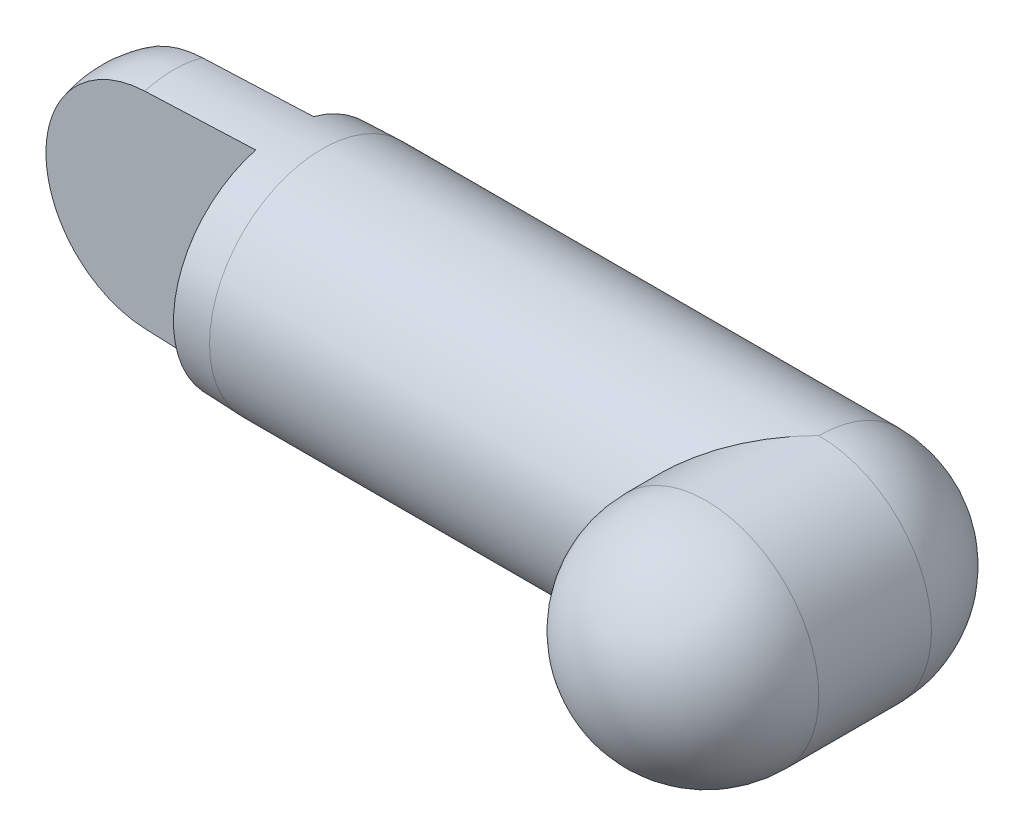
ISO-10303-21;
HEADER;
FILE_DESCRIPTION(('STEP AP214'),'2;1');
FILE_NAME('part.step','',(''),(''),'','','');
FILE_SCHEMA(('AUTOMOTIVE_DESIGN { 1 0 10303 214 1 1 1 1 }'));
ENDSEC;
DATA;
#1=APPLICATION_CONTEXT('core data for automotive mechanical design processes');
#2=APPLICATION_PROTOCOL_DEFINITION('international standard','automotive_design',2000,#1);
#3=PRODUCT_CONTEXT('',#1,'mechanical');
#4=PRODUCT('Part','Part','',(#3));
#5=PRODUCT_RELATED_PRODUCT_CATEGORY('part','',(#4));
#6=PRODUCT_DEFINITION_FORMATION('','',#4);
#7=PRODUCT_DEFINITION_CONTEXT('part definition',#1,'design');
#8=PRODUCT_DEFINITION('design','',#6,#7);
#9=PRODUCT_DEFINITION_SHAPE('','',#8);
#10=(LENGTH_UNIT() NAMED_UNIT(*) SI_UNIT(.MILLI.,.METRE.));
#11=(NAMED_UNIT(*) PLANE_ANGLE_UNIT() SI_UNIT($,.RADIAN.));
#12=(NAMED_UNIT(*) SI_UNIT($,.STERADIAN.) SOLID_ANGLE_UNIT());
#13=UNCERTAINTY_MEASURE_WITH_UNIT(LENGTH_MEASURE(1.E-05),#10,'distance_accuracy_value','');
#14=(GEOMETRIC_REPRESENTATION_CONTEXT(3) GLOBAL_UNCERTAINTY_ASSIGNED_CONTEXT((#13)) GLOBAL_UNIT_ASSIGNED_CONTEXT((#10,
#11,#12)) REPRESENTATION_CONTEXT('',''));
#15=CARTESIAN_POINT('',(0.,0.,0.));
#16=DIRECTION('',(0.,0.,1.));
#17=DIRECTION('',(1.,0.,0.));
#18=AXIS2_PLACEMENT_3D('',#15,#16,#17);
#19=CARTESIAN_POINT('',(-1000.,0.,0.));
#20=DIRECTION('',(-1.,0.,0.));
#21=DIRECTION('',(0.,0.,1.));
#22=AXIS2_PLACEMENT_3D('',#19,#20,#21);
#23=CYLINDRICAL_SURFACE('',#22,49.53);
#24=CARTESIAN_POINT('',(8.00000000000001,0.,0.));
#25=DIRECTION('',(-1.,0.,0.));
#26=DIRECTION('',(0.,0.,1.));
#27=AXIS2_PLACEMENT_3D('',#24,#25,#26);
#28=CIRCLE('',#27,49.53);
#29=CARTESIAN_POINT('',(8.00000000000001,0.,49.53));
#30=VERTEX_POINT('',#29);
#31=EDGE_CURVE('E143',#30,#30,#28,.T.);
#32=ORIENTED_EDGE('',*,*,#31,.F.);
#33=EDGE_LOOP('',(#32));
#34=FACE_BOUND('',#33,.T.);
#35=CARTESIAN_POINT('',(226.44,0.,0.));
#36=DIRECTION('',(-0.707106781186547,0.,-0.707106781186547));
#37=DIRECTION('',(-0.707106781186547,0.,0.707106781186547));
#38=AXIS2_PLACEMENT_3D('',#35,#36,#37);
#39=ELLIPSE('',#38,70.0459977443394,49.53);
#40=CARTESIAN_POINT('',(226.44,49.53,0.));
#41=VERTEX_POINT('',#40);
#42=CARTESIAN_POINT('',(176.91,0.,49.53));
#43=VERTEX_POINT('',#42);
#44=EDGE_CURVE('E86',#41,#43,#39,.F.);
#45=ORIENTED_EDGE('',*,*,#44,.F.);
#46=CARTESIAN_POINT('',(226.44,0.,0.));
#47=DIRECTION('',(-1.,0.,0.));
#48=DIRECTION('',(0.,0.,1.));
#49=AXIS2_PLACEMENT_3D('',#46,#47,#48);
#50=CIRCLE('',#49,49.53);
#51=CARTESIAN_POINT('',(226.44,-49.53,0.));
#52=VERTEX_POINT('',#51);
#53=EDGE_CURVE('E137',#41,#52,#50,.T.);
#54=ORIENTED_EDGE('',*,*,#53,.T.);
#55=EDGE_CURVE('E84',#43,#52,#39,.F.);
#56=ORIENTED_EDGE('',*,*,#55,.F.);
#57=EDGE_LOOP('',(#45,#54,#56));
#58=FACE_BOUND('',#57,.T.);
#59=ADVANCED_FACE('F32',(#34,#58),#23,.T.);
#60=CARTESIAN_POINT('',(226.44,0.,0.));
#61=DIRECTION('',(-1.,0.,0.));
#62=DIRECTION('',(0.,1.,0.));
#63=AXIS2_PLACEMENT_3D('',#60,#61,#62);
#64=SPHERICAL_SURFACE('',#63,49.53);
#65=CARTESIAN_POINT('',(226.44,0.,0.));
#66=DIRECTION('',(0.,0.,1.));
#67=DIRECTION('',(1.,0.,0.));
#68=AXIS2_PLACEMENT_3D('',#65,#66,#67);
#69=CIRCLE('',#68,49.53);
#70=EDGE_CURVE('E11',#52,#41,#69,.T.);
#71=ORIENTED_EDGE('',*,*,#70,.F.);
#72=ORIENTED_EDGE('',*,*,#53,.F.);
#73=EDGE_LOOP('',(#71,#72));
#74=FACE_BOUND('',#73,.T.);
#75=ADVANCED_FACE('F173',(#74),#64,.T.);
#76=CARTESIAN_POINT('',(8.00000000000001,0.,0.));
#77=DIRECTION('',(1.,0.,0.));
#78=DIRECTION('',(0.,0.,-1.));
#79=AXIS2_PLACEMENT_3D('',#76,#77,#78);
#80=CONICAL_SURFACE('',#79,49.53,0.0394047098946294);
#81=CARTESIAN_POINT('',(-8.50999999999998,0.,0.));
#82=DIRECTION('',(1.,0.,0.));
#83=DIRECTION('',(0.,0.,-1.));
#84=AXIS2_PLACEMENT_3D('',#81,#82,#83);
#85=CIRCLE('',#84,48.8790913093582);
#86=CARTESIAN_POINT('',(-8.50999999999998,47.2003767699853,12.7));
#87=VERTEX_POINT('',#86);
#88=CARTESIAN_POINT('',(-8.50999999999998,-47.2003767699853,12.7));
#89=VERTEX_POINT('',#88);
#90=EDGE_CURVE('E39',#87,#89,#85,.T.);
#91=ORIENTED_EDGE('',*,*,#90,.T.);
#92=CARTESIAN_POINT('',(45.6747613557123,-49.4092510401004,12.7));
#93=CARTESIAN_POINT('',(30.479487149877,-48.7906974408684,12.7));
#94=CARTESIAN_POINT('',(15.2842417925003,-48.171434665365,12.7));
#95=CARTESIAN_POINT('',(-15.1061827976547,-46.9312941967949,12.7));
#96=CARTESIAN_POINT('',(-30.301362030434,-46.3104165037516,12.7));
#97=CARTESIAN_POINT('',(-60.6916464349743,-45.0668496150844,12.7));
#98=CARTESIAN_POINT('',(-75.8867516067351,-44.4441604194545,12.7));
#99=CARTESIAN_POINT('',(-106.276877440123,-43.1967179408456,12.7));
#100=CARTESIAN_POINT('',(-121.471898101749,-42.5719646578364,12.7));
#101=CARTESIAN_POINT('',(-136.666871087388,-41.946053046802,12.7));
#102=B_SPLINE_CURVE_WITH_KNOTS('',3,(#92,#93,#94,#95,#96,#97,#98,#99,#100,#101),.UNSPECIFIED.,
.F.,.F.,(4,2,2,2,4),(0.,45.623576161825,91.2471516604404,136.87072730764,182.494303618714),.UNSPECIFIED.);
#103=CARTESIAN_POINT('',(-57.351148175243,-45.2033555218337,12.7));
#104=VERTEX_POINT('',#103);
#105=EDGE_CURVE('E98',#89,#104,#102,.T.);
#106=ORIENTED_EDGE('',*,*,#105,.T.);
#107=CARTESIAN_POINT('',(-57.351148175243,0.,0.));
#108=DIRECTION('',(-1.,0.,0.));
#109=DIRECTION('',(0.,0.,1.));
#110=AXIS2_PLACEMENT_3D('',#107,#108,#109);
#111=CIRCLE('',#110,46.9535233015936);
#112=CARTESIAN_POINT('',(-57.351148175243,-45.2033555218337,-12.7));
#113=VERTEX_POINT('',#112);
#114=EDGE_CURVE('E140',#113,#104,#111,.T.);
#115=ORIENTED_EDGE('',*,*,#114,.F.);
#116=CARTESIAN_POINT('',(-136.666871087388,-41.946053046802,-12.7));
#117=CARTESIAN_POINT('',(-121.471898101749,-42.5719646578364,-12.7));
#118=CARTESIAN_POINT('',(-106.276877440123,-43.1967179408456,-12.7));
#119=CARTESIAN_POINT('',(-75.8867516067351,-44.4441604194545,-12.7));
#120=CARTESIAN_POINT('',(-60.6916464349743,-45.0668496150844,-12.7));
#121=CARTESIAN_POINT('',(-30.301362030434,-46.3104165037516,-12.7));
#122=CARTESIAN_POINT('',(-15.1061827976547,-46.9312941967949,-12.7));
#123=CARTESIAN_POINT('',(15.2842417925002,-48.171434665365,-12.7));
#124=CARTESIAN_POINT('',(30.4794871498769,-48.7906974408684,-12.7));
#125=CARTESIAN_POINT('',(45.6747613557123,-49.4092510401004,-12.7));
#126=B_SPLINE_CURVE_WITH_KNOTS('',3,(#116,#117,#118,#119,#120,#121,#122,#123,#124,#125),
.UNSPECIFIED.,.F.,.F.,(4,2,2,2,4),(0.,45.6235763110733,91.2471519582732,136.870727456889,
182.494303618714),.UNSPECIFIED.);
#127=CARTESIAN_POINT('',(-8.50999999999998,-47.2003767699853,-12.7));
#128=VERTEX_POINT('',#127);
#129=EDGE_CURVE('E131',#113,#128,#126,.T.);
#130=ORIENTED_EDGE('',*,*,#129,.T.);
#131=CARTESIAN_POINT('',(-8.50999999999998,0.,0.));
#132=DIRECTION('',(1.,0.,0.));
#133=DIRECTION('',(0.,0.,-1.));
#134=AXIS2_PLACEMENT_3D('',#131,#132,#133);
#135=CIRCLE('',#134,48.8790913093582);
#136=CARTESIAN_POINT('',(-8.50999999999998,47.2003767699853,-12.7));
#137=VERTEX_POINT('',#136);
#138=EDGE_CURVE('E149',#128,#137,#135,.T.);
#139=ORIENTED_EDGE('',*,*,#138,.T.);
#140=CARTESIAN_POINT('',(45.6747613557123,49.4092510401004,-12.7));
#141=CARTESIAN_POINT('',(30.4794871498769,48.7906974408684,-12.7));
#142=CARTESIAN_POINT('',(15.2842417925002,48.171434665365,-12.7));
#143=CARTESIAN_POINT('',(-15.1061827976547,46.9312941967949,-12.7));
#144=CARTESIAN_POINT('',(-30.301362030434,46.3104165037516,-12.7));
#145=CARTESIAN_POINT('',(-60.6916464349743,45.0668496150844,-12.7));
#146=CARTESIAN_POINT('',(-75.8867516067351,44.4441604194545,-12.7));
#147=CARTESIAN_POINT('',(-106.276877440123,43.1967179408456,-12.7));
#148=CARTESIAN_POINT('',(-121.471898101749,42.5719646578364,-12.7));
#149=CARTESIAN_POINT('',(-136.666871087388,41.946053046802,-12.7));
#150=B_SPLINE_CURVE_WITH_KNOTS('',3,(#140,#141,#142,#143,#144,#145,#146,#147,#148,#149),
.UNSPECIFIED.,.F.,.F.,(4,2,2,2,4),(0.,45.623576161825,91.2471516604404,136.87072730764,
182.494303618714),.UNSPECIFIED.);
#151=CARTESIAN_POINT('',(-57.351148175243,45.2033555218337,-12.7));
#152=VERTEX_POINT('',#151);
#153=EDGE_CURVE('E126',#137,#152,#150,.T.);
#154=ORIENTED_EDGE('',*,*,#153,.T.);
#155=CARTESIAN_POINT('',(-57.351148175243,45.2033555218337,12.7));
#156=VERTEX_POINT('',#155);
#157=EDGE_CURVE('E139',#156,#152,#111,.T.);
#158=ORIENTED_EDGE('',*,*,#157,.F.);
#159=CARTESIAN_POINT('',(-136.666871087388,41.946053046802,12.7));
#160=CARTESIAN_POINT('',(-121.471898101749,42.5719646578364,12.7));
#161=CARTESIAN_POINT('',(-106.276877440123,43.1967179408456,12.7));
#162=CARTESIAN_POINT('',(-75.8867516067351,44.4441604194545,12.7));
#163=CARTESIAN_POINT('',(-60.6916464349742,45.0668496150844,12.7));
#164=CARTESIAN_POINT('',(-30.3013620304339,46.3104165037516,12.7));
#165=CARTESIAN_POINT('',(-15.1061827976547,46.9312941967949,12.7));
#166=CARTESIAN_POINT('',(15.2842417925003,48.171434665365,12.7));
#167=CARTESIAN_POINT('',(30.479487149877,48.7906974408684,12.7));
#168=CARTESIAN_POINT('',(45.6747613557123,49.4092510401004,12.7));
#169=B_SPLINE_CURVE_WITH_KNOTS('',3,(#159,#160,#161,#162,#163,#164,#165,#166,#167,#168),
.UNSPECIFIED.,.F.,.F.,(4,2,2,2,4),(0.,45.6235763110733,91.2471519582732,136.870727456889,
182.494303618714),.UNSPECIFIED.);
#170=EDGE_CURVE('E51',#156,#87,#169,.T.);
#171=ORIENTED_EDGE('',*,*,#170,.T.);
#172=EDGE_LOOP('',(#91,#106,#115,#130,#139,#154,#158,#171));
#173=FACE_BOUND('',#172,.T.);
#174=ORIENTED_EDGE('',*,*,#31,.T.);
#175=EDGE_LOOP('',(#174));
#176=FACE_BOUND('',#175,.T.);
#177=ADVANCED_FACE('F103',(#173,#176),#80,.T.);
#178=CARTESIAN_POINT('',(-55.5,0.,0.));
#179=DIRECTION('',(-1.,0.,0.));
#180=DIRECTION('',(0.,1.,0.));
#181=AXIS2_PLACEMENT_3D('',#178,#179,#180);
#182=SPHERICAL_SURFACE('',#181,46.99);
#183=ORIENTED_EDGE('',*,*,#114,.T.);
#184=CARTESIAN_POINT('',(-55.5,0.,12.7));
#185=DIRECTION('',(0.,0.,-1.));
#186=DIRECTION('',(-1.,0.,0.));
#187=AXIS2_PLACEMENT_3D('',#184,#185,#186);
#188=CIRCLE('',#187,45.2412433516145);
#189=EDGE_CURVE('E152',#104,#156,#188,.T.);
#190=ORIENTED_EDGE('',*,*,#189,.T.);
#191=ORIENTED_EDGE('',*,*,#157,.T.);
#192=CARTESIAN_POINT('',(-55.5,0.,-12.7));
#193=DIRECTION('',(0.,0.,1.));
#194=DIRECTION('',(1.,0.,0.));
#195=AXIS2_PLACEMENT_3D('',#192,#193,#194);
#196=CIRCLE('',#195,45.2412433516145);
#197=EDGE_CURVE('E146',#152,#113,#196,.T.);
#198=ORIENTED_EDGE('',*,*,#197,.T.);
#199=EDGE_LOOP('',(#183,#190,#191,#198));
#200=FACE_BOUND('',#199,.T.);
#201=ADVANCED_FACE('F167',(#200),#182,.T.);
#202=CARTESIAN_POINT('',(-8.50999999999999,-49.53,-88.9));
#203=DIRECTION('',(1.,0.,0.));
#204=DIRECTION('',(0.,0.,-1.));
#205=AXIS2_PLACEMENT_3D('',#202,#203,#204);
#206=PLANE('',#205);
#207=DIRECTION('',(0.,1.,0.));
#208=VECTOR('',#207,1.);
#209=CARTESIAN_POINT('',(-8.50999999999998,-49.53,-12.7));
#210=LINE('',#209,#208);
#211=EDGE_CURVE('E160',#128,#137,#210,.T.);
#212=ORIENTED_EDGE('',*,*,#211,.T.);
#213=ORIENTED_EDGE('',*,*,#138,.F.);
#214=EDGE_LOOP('',(#212,#213));
#215=FACE_BOUND('',#214,.T.);
#216=ADVANCED_FACE('F121',(#215),#206,.F.);
#217=CARTESIAN_POINT('',(-102.49,-49.53,-12.7));
#218=DIRECTION('',(0.,0.,1.));
#219=DIRECTION('',(1.,0.,0.));
#220=AXIS2_PLACEMENT_3D('',#217,#218,#219);
#221=PLANE('',#220);
#222=ORIENTED_EDGE('',*,*,#197,.F.);
#223=ORIENTED_EDGE('',*,*,#153,.F.);
#224=ORIENTED_EDGE('',*,*,#211,.F.);
#225=ORIENTED_EDGE('',*,*,#129,.F.);
#226=EDGE_LOOP('',(#222,#223,#224,#225));
#227=FACE_BOUND('',#226,.T.);
#228=ADVANCED_FACE('F116',(#227),#221,.F.);
#229=CARTESIAN_POINT('',(-8.50999999999999,-49.53,88.9));
#230=DIRECTION('',(1.,0.,0.));
#231=DIRECTION('',(0.,0.,-1.));
#232=AXIS2_PLACEMENT_3D('',#229,#230,#231);
#233=PLANE('',#232);
#234=DIRECTION('',(0.,1.,0.));
#235=VECTOR('',#234,1.);
#236=CARTESIAN_POINT('',(-8.50999999999998,-49.53,12.7));
#237=LINE('',#236,#235);
#238=EDGE_CURVE('E91',#89,#87,#237,.T.);
#239=ORIENTED_EDGE('',*,*,#238,.F.);
#240=ORIENTED_EDGE('',*,*,#90,.F.);
#241=EDGE_LOOP('',(#239,#240));
#242=FACE_BOUND('',#241,.T.);
#243=ADVANCED_FACE('F111',(#242),#233,.F.);
#244=CARTESIAN_POINT('',(-102.49,-49.53,12.7));
#245=DIRECTION('',(0.,0.,-1.));
#246=DIRECTION('',(-1.,0.,0.));
#247=AXIS2_PLACEMENT_3D('',#244,#245,#246);
#248=PLANE('',#247);
#249=ORIENTED_EDGE('',*,*,#238,.T.);
#250=ORIENTED_EDGE('',*,*,#170,.F.);
#251=ORIENTED_EDGE('',*,*,#189,.F.);
#252=ORIENTED_EDGE('',*,*,#105,.F.);
#253=EDGE_LOOP('',(#249,#250,#251,#252));
#254=FACE_BOUND('',#253,.T.);
#255=ADVANCED_FACE('F106',(#254),#248,.F.);
#256=CARTESIAN_POINT('',(226.44,0.,49.53));
#257=DIRECTION('',(0.,0.,-1.));
#258=DIRECTION('',(-1.,0.,0.));
#259=AXIS2_PLACEMENT_3D('',#256,#257,#258);
#260=CYLINDRICAL_SURFACE('',#259,49.53);
#261=ORIENTED_EDGE('',*,*,#70,.T.);
#262=ORIENTED_EDGE('',*,*,#44,.T.);
#263=CARTESIAN_POINT('',(226.44,0.,49.53));
#264=DIRECTION('',(0.,0.,1.));
#265=DIRECTION('',(1.,0.,0.));
#266=AXIS2_PLACEMENT_3D('',#263,#264,#265);
#267=CIRCLE('',#266,49.53);
#268=EDGE_CURVE('E81',#43,#43,#267,.T.);
#269=ORIENTED_EDGE('',*,*,#268,.F.);
#270=ORIENTED_EDGE('',*,*,#55,.T.);
#271=EDGE_LOOP('',(#261,#262,#269,#270));
#272=FACE_BOUND('',#271,.T.);
#273=ADVANCED_FACE('F82',(#272),#260,.T.);
#274=CARTESIAN_POINT('',(226.44,0.,49.53));
#275=DIRECTION('',(-1.,0.,0.));
#276=DIRECTION('',(0.,1.,0.));
#277=AXIS2_PLACEMENT_3D('',#274,#275,#276);
#278=SPHERICAL_SURFACE('',#277,49.53);
#279=CARTESIAN_POINT('',(226.44,0.,49.53));
#280=DIRECTION('',(0.,0.,1.));
#281=DIRECTION('',(1.,0.,0.));
#282=AXIS2_PLACEMENT_3D('',#279,#280,#281);
#283=SPHERICAL_SURFACE('',#282,49.53);
#284=ORIENTED_EDGE('',*,*,#268,.T.);
#285=EDGE_LOOP('',(#284));
#286=FACE_BOUND('',#285,.T.);
#287=ADVANCED_FACE('F231',(#286),#283,.T.);
#288=CLOSED_SHELL('',(#59,#75,#177,#201,#216,#228,#243,#255,#273,#287));
#289=MANIFOLD_SOLID_BREP('B2',#288);
#290=ADVANCED_BREP_SHAPE_REPRESENTATION('',(#18,#289),#14);
#291=SHAPE_DEFINITION_REPRESENTATION(#9,#290);
ENDSEC;
END-ISO-10303-21;
